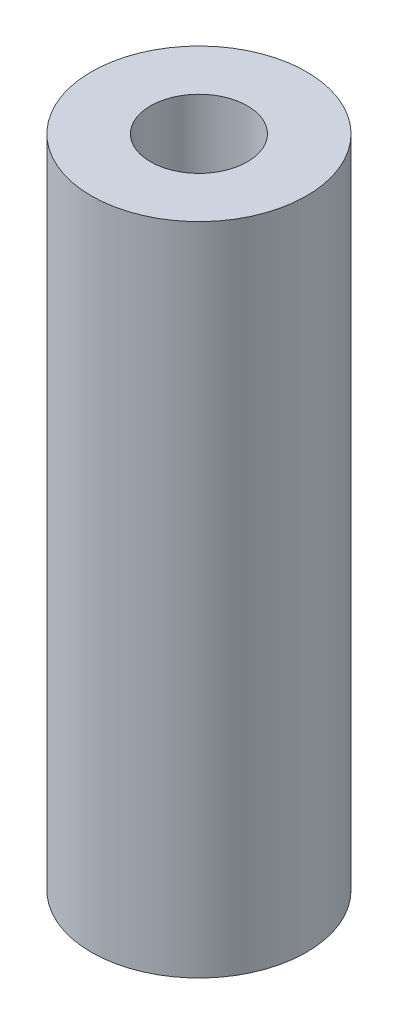
ISO-10303-21;
HEADER;
FILE_DESCRIPTION(('STEP AP214'),'2;1');
FILE_NAME('part.step','',(''),(''),'','','');
FILE_SCHEMA(('AUTOMOTIVE_DESIGN { 1 0 10303 214 1 1 1 1 }'));
ENDSEC;
DATA;
#1=APPLICATION_CONTEXT('core data for automotive mechanical design processes');
#2=APPLICATION_PROTOCOL_DEFINITION('international standard','automotive_design',2000,#1);
#3=PRODUCT_CONTEXT('',#1,'mechanical');
#4=PRODUCT('Part','Part','',(#3));
#5=PRODUCT_RELATED_PRODUCT_CATEGORY('part','',(#4));
#6=PRODUCT_DEFINITION_FORMATION('','',#4);
#7=PRODUCT_DEFINITION_CONTEXT('part definition',#1,'design');
#8=PRODUCT_DEFINITION('design','',#6,#7);
#9=PRODUCT_DEFINITION_SHAPE('','',#8);
#10=(LENGTH_UNIT() NAMED_UNIT(*) SI_UNIT(.MILLI.,.METRE.));
#11=(NAMED_UNIT(*) PLANE_ANGLE_UNIT() SI_UNIT($,.RADIAN.));
#12=(NAMED_UNIT(*) SI_UNIT($,.STERADIAN.) SOLID_ANGLE_UNIT());
#13=UNCERTAINTY_MEASURE_WITH_UNIT(LENGTH_MEASURE(1.E-05),#10,'distance_accuracy_value','');
#14=(GEOMETRIC_REPRESENTATION_CONTEXT(3) GLOBAL_UNCERTAINTY_ASSIGNED_CONTEXT((#13)) GLOBAL_UNIT_ASSIGNED_CONTEXT((#10,
#11,#12)) REPRESENTATION_CONTEXT('',''));
#15=CARTESIAN_POINT('',(0.,0.,0.));
#16=DIRECTION('',(0.,0.,1.));
#17=DIRECTION('',(1.,0.,0.));
#18=AXIS2_PLACEMENT_3D('',#15,#16,#17);
#19=CARTESIAN_POINT('',(0.,18.27,0.));
#20=DIRECTION('',(0.,-1.,0.));
#21=DIRECTION('',(0.,0.,-1.));
#22=AXIS2_PLACEMENT_3D('',#19,#20,#21);
#23=CYLINDRICAL_SURFACE('',#22,3.);
#24=CARTESIAN_POINT('',(0.,18.27,0.));
#25=DIRECTION('',(0.,1.,0.));
#26=DIRECTION('',(0.,0.,1.));
#27=AXIS2_PLACEMENT_3D('',#24,#25,#26);
#28=CIRCLE('',#27,3.);
#29=CARTESIAN_POINT('',(0.,18.27,3.));
#30=VERTEX_POINT('',#29);
#31=EDGE_CURVE('E10',#30,#30,#28,.T.);
#32=ORIENTED_EDGE('',*,*,#31,.F.);
#33=EDGE_LOOP('',(#32));
#34=FACE_BOUND('',#33,.T.);
#35=CARTESIAN_POINT('',(0.,0.,0.));
#36=DIRECTION('',(0.,1.,0.));
#37=DIRECTION('',(0.,0.,1.));
#38=AXIS2_PLACEMENT_3D('',#35,#36,#37);
#39=CIRCLE('',#38,3.);
#40=CARTESIAN_POINT('',(0.,0.,3.));
#41=VERTEX_POINT('',#40);
#42=EDGE_CURVE('E38',#41,#41,#39,.T.);
#43=ORIENTED_EDGE('',*,*,#42,.T.);
#44=EDGE_LOOP('',(#43));
#45=FACE_BOUND('',#44,.T.);
#46=ADVANCED_FACE('F35',(#34,#45),#23,.T.);
#47=CARTESIAN_POINT('',(0.,18.27,0.));
#48=DIRECTION('',(0.,1.,0.));
#49=DIRECTION('',(0.,0.,1.));
#50=AXIS2_PLACEMENT_3D('',#47,#48,#49);
#51=PLANE('',#50);
#52=CARTESIAN_POINT('',(0.,18.27,0.));
#53=DIRECTION('',(0.,1.,0.));
#54=DIRECTION('',(0.,0.,1.));
#55=AXIS2_PLACEMENT_3D('',#52,#53,#54);
#56=CIRCLE('',#55,1.35254999999999);
#57=CARTESIAN_POINT('',(0.,18.27,1.35254999999999));
#58=VERTEX_POINT('',#57);
#59=EDGE_CURVE('E45',#58,#58,#56,.T.);
#60=ORIENTED_EDGE('',*,*,#59,.F.);
#61=EDGE_LOOP('',(#60));
#62=FACE_BOUND('',#61,.T.);
#63=ORIENTED_EDGE('',*,*,#31,.T.);
#64=EDGE_LOOP('',(#63));
#65=FACE_BOUND('',#64,.T.);
#66=ADVANCED_FACE('F58',(#62,#65),#51,.T.);
#67=CARTESIAN_POINT('',(0.,0.,0.));
#68=DIRECTION('',(0.,1.,0.));
#69=DIRECTION('',(0.,0.,1.));
#70=AXIS2_PLACEMENT_3D('',#67,#68,#69);
#71=PLANE('',#70);
#72=CARTESIAN_POINT('',(0.,0.,0.));
#73=DIRECTION('',(0.,-1.,0.));
#74=DIRECTION('',(0.,0.,-1.));
#75=AXIS2_PLACEMENT_3D('',#72,#73,#74);
#76=CIRCLE('',#75,1.35254999999999);
#77=CARTESIAN_POINT('',(0.,0.,-1.35254999999999));
#78=VERTEX_POINT('',#77);
#79=EDGE_CURVE('E49',#78,#78,#76,.T.);
#80=ORIENTED_EDGE('',*,*,#79,.F.);
#81=EDGE_LOOP('',(#80));
#82=FACE_BOUND('',#81,.T.);
#83=ORIENTED_EDGE('',*,*,#42,.F.);
#84=EDGE_LOOP('',(#83));
#85=FACE_BOUND('',#84,.T.);
#86=ADVANCED_FACE('F55',(#82,#85),#71,.F.);
#87=CARTESIAN_POINT('',(0.,18.27,0.));
#88=DIRECTION('',(0.,1.,0.));
#89=DIRECTION('',(0.,0.,1.));
#90=AXIS2_PLACEMENT_3D('',#87,#88,#89);
#91=CYLINDRICAL_SURFACE('',#90,1.35254999999999);
#92=ORIENTED_EDGE('',*,*,#59,.T.);
#93=EDGE_LOOP('',(#92));
#94=FACE_BOUND('',#93,.T.);
#95=ORIENTED_EDGE('',*,*,#79,.T.);
#96=EDGE_LOOP('',(#95));
#97=FACE_BOUND('',#96,.T.);
#98=ADVANCED_FACE('F53',(#94,#97),#91,.F.);
#99=CLOSED_SHELL('',(#46,#66,#86,#98));
#100=MANIFOLD_SOLID_BREP('B2',#99);
#101=ADVANCED_BREP_SHAPE_REPRESENTATION('',(#18,#100),#14);
#102=SHAPE_DEFINITION_REPRESENTATION(#9,#101);
ENDSEC;
END-ISO-10303-21;
